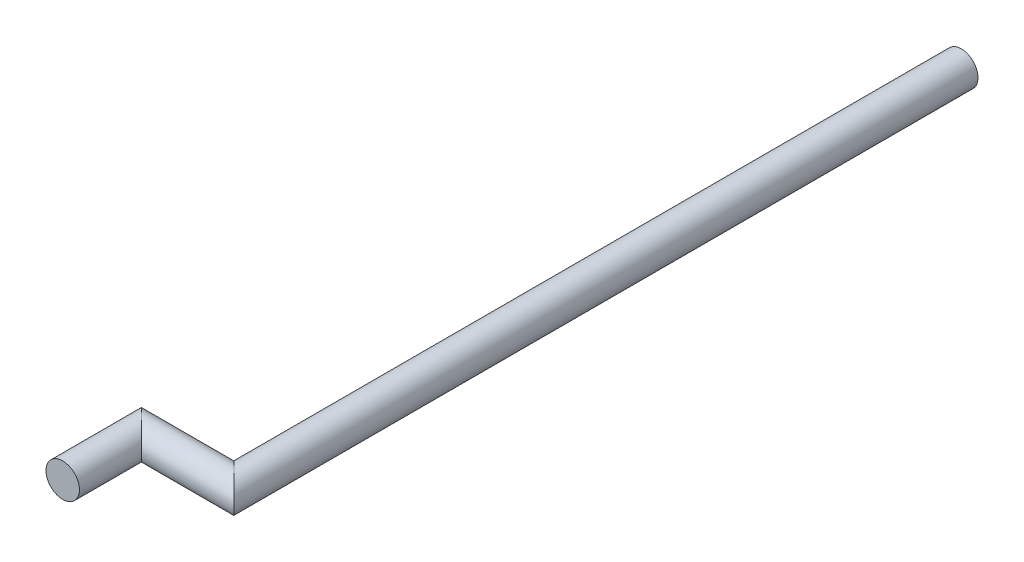
ISO-10303-21;
HEADER;
FILE_DESCRIPTION(('STEP AP214'),'2;1');
FILE_NAME('part.step','',(''),(''),'','','');
FILE_SCHEMA(('AUTOMOTIVE_DESIGN { 1 0 10303 214 1 1 1 1 }'));
ENDSEC;
DATA;
#1=APPLICATION_CONTEXT('core data for automotive mechanical design processes');
#2=APPLICATION_PROTOCOL_DEFINITION('international standard','automotive_design',2000,#1);
#3=PRODUCT_CONTEXT('',#1,'mechanical');
#4=PRODUCT('Part','Part','',(#3));
#5=PRODUCT_RELATED_PRODUCT_CATEGORY('part','',(#4));
#6=PRODUCT_DEFINITION_FORMATION('','',#4);
#7=PRODUCT_DEFINITION_CONTEXT('part definition',#1,'design');
#8=PRODUCT_DEFINITION('design','',#6,#7);
#9=PRODUCT_DEFINITION_SHAPE('','',#8);
#10=(LENGTH_UNIT() NAMED_UNIT(*) SI_UNIT(.MILLI.,.METRE.));
#11=(NAMED_UNIT(*) PLANE_ANGLE_UNIT() SI_UNIT($,.RADIAN.));
#12=(NAMED_UNIT(*) SI_UNIT($,.STERADIAN.) SOLID_ANGLE_UNIT());
#13=UNCERTAINTY_MEASURE_WITH_UNIT(LENGTH_MEASURE(1.E-05),#10,'distance_accuracy_value','');
#14=(GEOMETRIC_REPRESENTATION_CONTEXT(3) GLOBAL_UNCERTAINTY_ASSIGNED_CONTEXT((#13)) GLOBAL_UNIT_ASSIGNED_CONTEXT((#10,
#11,#12)) REPRESENTATION_CONTEXT('',''));
#15=CARTESIAN_POINT('',(0.,0.,0.));
#16=DIRECTION('',(0.,0.,1.));
#17=DIRECTION('',(1.,0.,0.));
#18=AXIS2_PLACEMENT_3D('',#15,#16,#17);
#19=CARTESIAN_POINT('',(4.7,0.,-41.));
#20=DIRECTION('',(0.,0.,1.));
#21=DIRECTION('',(1.,0.,0.));
#22=AXIS2_PLACEMENT_3D('',#19,#20,#21);
#23=PLANE('',#22);
#24=CARTESIAN_POINT('',(4.7,0.,-41.));
#25=DIRECTION('',(0.,0.,1.));
#26=DIRECTION('',(1.,0.,0.));
#27=AXIS2_PLACEMENT_3D('',#24,#25,#26);
#28=CIRCLE('',#27,0.85);
#29=CARTESIAN_POINT('',(5.55,0.,-41.));
#30=VERTEX_POINT('',#29);
#31=EDGE_CURVE('E34',#30,#30,#28,.T.);
#32=ORIENTED_EDGE('',*,*,#31,.F.);
#33=EDGE_LOOP('',(#32));
#34=FACE_BOUND('',#33,.T.);
#35=ADVANCED_FACE('F31',(#34),#23,.F.);
#36=CARTESIAN_POINT('',(0.,0.,0.));
#37=DIRECTION('',(0.,0.,1.));
#38=DIRECTION('',(1.,0.,0.));
#39=AXIS2_PLACEMENT_3D('',#36,#37,#38);
#40=PLANE('',#39);
#41=CARTESIAN_POINT('',(0.,0.,0.));
#42=DIRECTION('',(0.,0.,1.));
#43=DIRECTION('',(1.,0.,0.));
#44=AXIS2_PLACEMENT_3D('',#41,#42,#43);
#45=CIRCLE('',#44,0.85);
#46=CARTESIAN_POINT('',(0.85,0.,0.));
#47=VERTEX_POINT('',#46);
#48=EDGE_CURVE('E38',#47,#47,#45,.T.);
#49=ORIENTED_EDGE('',*,*,#48,.T.);
#50=EDGE_LOOP('',(#49));
#51=FACE_BOUND('',#50,.T.);
#52=ADVANCED_FACE('F54',(#51),#40,.T.);
#53=CARTESIAN_POINT('',(4.7,0.,-2.965));
#54=DIRECTION('',(0.,0.,-1.));
#55=DIRECTION('',(-1.,0.,0.));
#56=AXIS2_PLACEMENT_3D('',#53,#54,#55);
#57=CYLINDRICAL_SURFACE('',#56,0.85);
#58=CARTESIAN_POINT('',(4.7,0.,-4.));
#59=DIRECTION('',(0.707106781186547,0.,-0.707106781186547));
#60=DIRECTION('',(0.707106781186548,0.,0.707106781186548));
#61=AXIS2_PLACEMENT_3D('',#58,#59,#60);
#62=ELLIPSE('',#61,1.20208152801713,0.85);
#63=CARTESIAN_POINT('',(5.55,0.,-3.15));
#64=VERTEX_POINT('',#63);
#65=EDGE_CURVE('E43',#64,#64,#62,.T.);
#66=ORIENTED_EDGE('',*,*,#65,.T.);
#67=EDGE_LOOP('',(#66));
#68=FACE_BOUND('',#67,.T.);
#69=ORIENTED_EDGE('',*,*,#31,.T.);
#70=EDGE_LOOP('',(#69));
#71=FACE_BOUND('',#70,.T.);
#72=ADVANCED_FACE('F51',(#68,#71),#57,.T.);
#73=CARTESIAN_POINT('',(-1.035,0.,-4.));
#74=DIRECTION('',(1.,0.,0.));
#75=DIRECTION('',(0.,0.,-1.));
#76=AXIS2_PLACEMENT_3D('',#73,#74,#75);
#77=CYLINDRICAL_SURFACE('',#76,0.85);
#78=CARTESIAN_POINT('',(0.,0.,-4.));
#79=DIRECTION('',(0.707106781186547,0.,-0.707106781186547));
#80=DIRECTION('',(-0.707106781186548,0.,-0.707106781186548));
#81=AXIS2_PLACEMENT_3D('',#78,#79,#80);
#82=ELLIPSE('',#81,1.20208152801713,0.85);
#83=CARTESIAN_POINT('',(-0.85,0.,-4.85));
#84=VERTEX_POINT('',#83);
#85=EDGE_CURVE('E10',#84,#84,#82,.T.);
#86=ORIENTED_EDGE('',*,*,#85,.T.);
#87=EDGE_LOOP('',(#86));
#88=FACE_BOUND('',#87,.T.);
#89=ORIENTED_EDGE('',*,*,#65,.F.);
#90=EDGE_LOOP('',(#89));
#91=FACE_BOUND('',#90,.T.);
#92=ADVANCED_FACE('F61',(#88,#91),#77,.T.);
#93=CARTESIAN_POINT('',(0.,0.,0.));
#94=DIRECTION('',(0.,0.,-1.));
#95=DIRECTION('',(-1.,0.,0.));
#96=AXIS2_PLACEMENT_3D('',#93,#94,#95);
#97=CYLINDRICAL_SURFACE('',#96,0.85);
#98=ORIENTED_EDGE('',*,*,#48,.F.);
#99=EDGE_LOOP('',(#98));
#100=FACE_BOUND('',#99,.T.);
#101=ORIENTED_EDGE('',*,*,#85,.F.);
#102=EDGE_LOOP('',(#101));
#103=FACE_BOUND('',#102,.T.);
#104=ADVANCED_FACE('F59',(#100,#103),#97,.T.);
#105=CLOSED_SHELL('',(#35,#52,#72,#92,#104));
#106=MANIFOLD_SOLID_BREP('B2',#105);
#107=ADVANCED_BREP_SHAPE_REPRESENTATION('',(#18,#106),#14);
#108=SHAPE_DEFINITION_REPRESENTATION(#9,#107);
ENDSEC;
END-ISO-10303-21;
